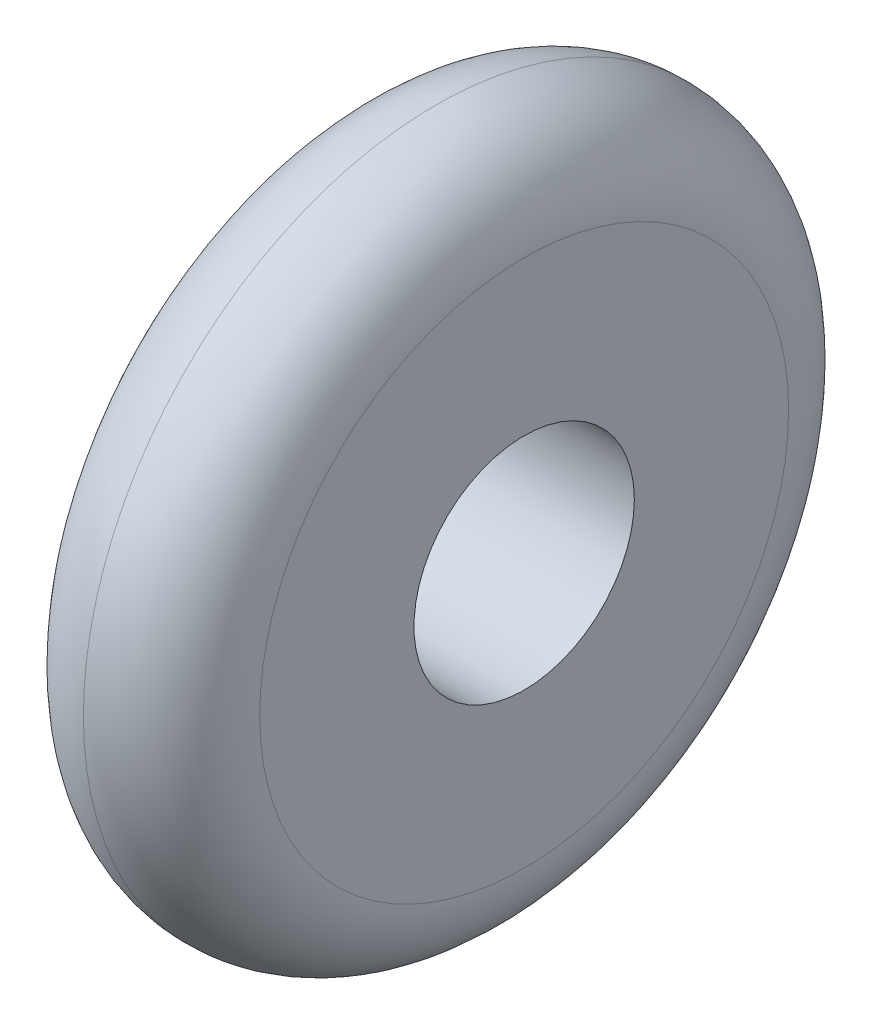
ISO-10303-21;
HEADER;
FILE_DESCRIPTION(('STEP AP214'),'2;1');
FILE_NAME('part.step','',(''),(''),'','','');
FILE_SCHEMA(('AUTOMOTIVE_DESIGN { 1 0 10303 214 1 1 1 1 }'));
ENDSEC;
DATA;
#1=APPLICATION_CONTEXT('core data for automotive mechanical design processes');
#2=APPLICATION_PROTOCOL_DEFINITION('international standard','automotive_design',2000,#1);
#3=PRODUCT_CONTEXT('',#1,'mechanical');
#4=PRODUCT('Part','Part','',(#3));
#5=PRODUCT_RELATED_PRODUCT_CATEGORY('part','',(#4));
#6=PRODUCT_DEFINITION_FORMATION('','',#4);
#7=PRODUCT_DEFINITION_CONTEXT('part definition',#1,'design');
#8=PRODUCT_DEFINITION('design','',#6,#7);
#9=PRODUCT_DEFINITION_SHAPE('','',#8);
#10=(LENGTH_UNIT() NAMED_UNIT(*) SI_UNIT(.MILLI.,.METRE.));
#11=(NAMED_UNIT(*) PLANE_ANGLE_UNIT() SI_UNIT($,.RADIAN.));
#12=(NAMED_UNIT(*) SI_UNIT($,.STERADIAN.) SOLID_ANGLE_UNIT());
#13=UNCERTAINTY_MEASURE_WITH_UNIT(LENGTH_MEASURE(1.E-05),#10,'distance_accuracy_value','');
#14=(GEOMETRIC_REPRESENTATION_CONTEXT(3) GLOBAL_UNCERTAINTY_ASSIGNED_CONTEXT((#13)) GLOBAL_UNIT_ASSIGNED_CONTEXT((#10,
#11,#12)) REPRESENTATION_CONTEXT('',''));
#15=CARTESIAN_POINT('',(0.,0.,0.));
#16=DIRECTION('',(0.,0.,1.));
#17=DIRECTION('',(1.,0.,0.));
#18=AXIS2_PLACEMENT_3D('',#15,#16,#17);
#19=CARTESIAN_POINT('',(20.,0.,0.));
#20=DIRECTION('',(1.,0.,0.));
#21=DIRECTION('',(0.,0.,-1.));
#22=AXIS2_PLACEMENT_3D('',#19,#20,#21);
#23=PLANE('',#22);
#24=CARTESIAN_POINT('',(20.,0.,0.));
#25=DIRECTION('',(1.,0.,0.));
#26=DIRECTION('',(0.,0.,-1.));
#27=AXIS2_PLACEMENT_3D('',#24,#25,#26);
#28=CIRCLE('',#27,12.5);
#29=CARTESIAN_POINT('',(20.,0.,-12.5));
#30=VERTEX_POINT('',#29);
#31=EDGE_CURVE('E45',#30,#30,#28,.T.);
#32=ORIENTED_EDGE('',*,*,#31,.F.);
#33=EDGE_LOOP('',(#32));
#34=FACE_BOUND('',#33,.T.);
#35=CARTESIAN_POINT('',(20.,0.,0.));
#36=DIRECTION('',(1.,0.,0.));
#37=DIRECTION('',(0.,0.,-1.));
#38=AXIS2_PLACEMENT_3D('',#35,#36,#37);
#39=CIRCLE('',#38,30.);
#40=CARTESIAN_POINT('',(20.,0.,-30.));
#41=VERTEX_POINT('',#40);
#42=EDGE_CURVE('E10',#41,#41,#39,.T.);
#43=ORIENTED_EDGE('',*,*,#42,.T.);
#44=EDGE_LOOP('',(#43));
#45=FACE_BOUND('',#44,.T.);
#46=ADVANCED_FACE('F31',(#34,#45),#23,.T.);
#47=CARTESIAN_POINT('',(0.,0.,0.));
#48=DIRECTION('',(1.,0.,0.));
#49=DIRECTION('',(0.,0.,-1.));
#50=AXIS2_PLACEMENT_3D('',#47,#48,#49);
#51=PLANE('',#50);
#52=CARTESIAN_POINT('',(0.,0.,0.));
#53=DIRECTION('',(1.,0.,0.));
#54=DIRECTION('',(0.,0.,-1.));
#55=AXIS2_PLACEMENT_3D('',#52,#53,#54);
#56=CIRCLE('',#55,12.5);
#57=CARTESIAN_POINT('',(0.,0.,-12.5));
#58=VERTEX_POINT('',#57);
#59=EDGE_CURVE('E48',#58,#58,#56,.T.);
#60=ORIENTED_EDGE('',*,*,#59,.T.);
#61=EDGE_LOOP('',(#60));
#62=FACE_BOUND('',#61,.T.);
#63=CARTESIAN_POINT('',(0.,0.,0.));
#64=DIRECTION('',(1.,0.,0.));
#65=DIRECTION('',(0.,0.,-1.));
#66=AXIS2_PLACEMENT_3D('',#63,#64,#65);
#67=CIRCLE('',#66,30.);
#68=CARTESIAN_POINT('',(0.,0.,-30.));
#69=VERTEX_POINT('',#68);
#70=EDGE_CURVE('E39',#69,#69,#67,.F.);
#71=ORIENTED_EDGE('',*,*,#70,.T.);
#72=EDGE_LOOP('',(#71));
#73=FACE_BOUND('',#72,.T.);
#74=ADVANCED_FACE('F58',(#62,#73),#51,.F.);
#75=CARTESIAN_POINT('',(10.,0.,0.));
#76=DIRECTION('',(1.,0.,0.));
#77=DIRECTION('',(0.,0.,-1.));
#78=AXIS2_PLACEMENT_3D('',#75,#76,#77);
#79=TOROIDAL_SURFACE('',#78,30.,10.);
#80=ORIENTED_EDGE('',*,*,#42,.F.);
#81=EDGE_LOOP('',(#80));
#82=FACE_BOUND('',#81,.T.);
#83=CARTESIAN_POINT('',(10.,0.,0.));
#84=DIRECTION('',(1.,0.,0.));
#85=DIRECTION('',(0.,0.,-1.));
#86=AXIS2_PLACEMENT_3D('',#83,#84,#85);
#87=CIRCLE('',#86,40.);
#88=CARTESIAN_POINT('',(10.,0.,-40.));
#89=VERTEX_POINT('',#88);
#90=EDGE_CURVE('E35',#89,#89,#87,.F.);
#91=ORIENTED_EDGE('',*,*,#90,.F.);
#92=EDGE_LOOP('',(#91));
#93=FACE_BOUND('',#92,.T.);
#94=ADVANCED_FACE('F33',(#82,#93),#79,.T.);
#95=CARTESIAN_POINT('',(10.,0.,0.));
#96=DIRECTION('',(1.,0.,0.));
#97=DIRECTION('',(0.,0.,-1.));
#98=AXIS2_PLACEMENT_3D('',#95,#96,#97);
#99=TOROIDAL_SURFACE('',#98,30.,10.);
#100=ORIENTED_EDGE('',*,*,#70,.F.);
#101=EDGE_LOOP('',(#100));
#102=FACE_BOUND('',#101,.T.);
#103=ORIENTED_EDGE('',*,*,#90,.T.);
#104=EDGE_LOOP('',(#103));
#105=FACE_BOUND('',#104,.T.);
#106=ADVANCED_FACE('F55',(#102,#105),#99,.T.);
#107=CARTESIAN_POINT('',(0.,0.,0.));
#108=DIRECTION('',(1.,0.,0.));
#109=DIRECTION('',(0.,0.,-1.));
#110=AXIS2_PLACEMENT_3D('',#107,#108,#109);
#111=CYLINDRICAL_SURFACE('',#110,12.5);
#112=ORIENTED_EDGE('',*,*,#59,.F.);
#113=EDGE_LOOP('',(#112));
#114=FACE_BOUND('',#113,.T.);
#115=ORIENTED_EDGE('',*,*,#31,.T.);
#116=EDGE_LOOP('',(#115));
#117=FACE_BOUND('',#116,.T.);
#118=ADVANCED_FACE('F64',(#114,#117),#111,.F.);
#119=CLOSED_SHELL('',(#46,#74,#94,#106,#118));
#120=MANIFOLD_SOLID_BREP('B2',#119);
#121=ADVANCED_BREP_SHAPE_REPRESENTATION('',(#18,#120),#14);
#122=SHAPE_DEFINITION_REPRESENTATION(#9,#121);
ENDSEC;
END-ISO-10303-21;
